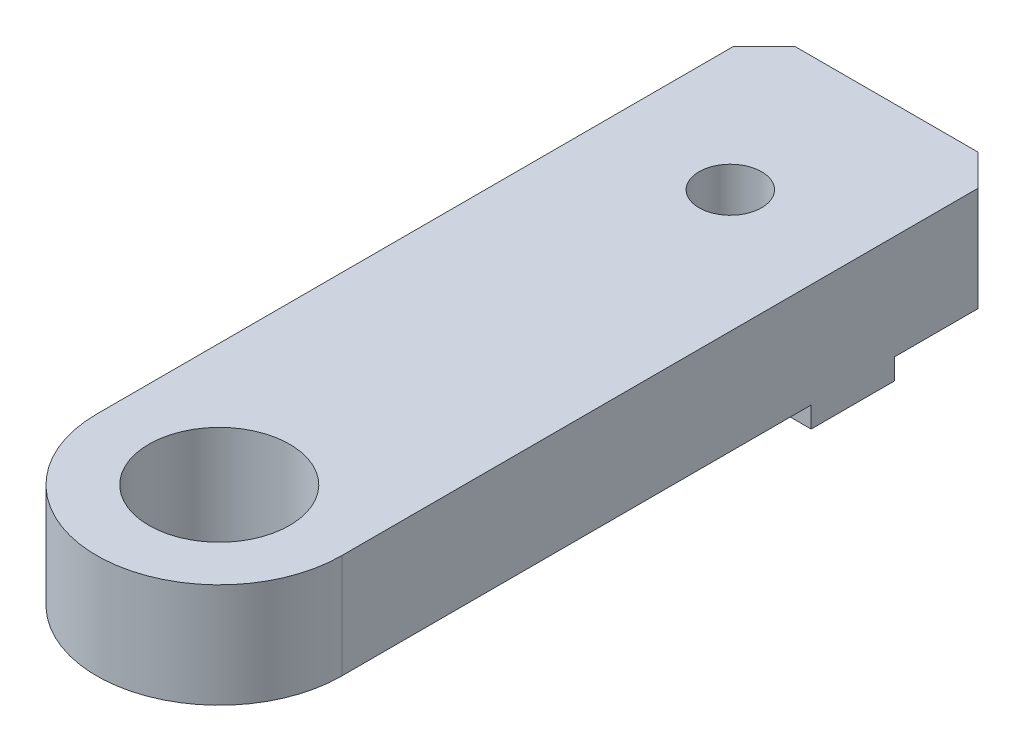
ISO-10303-21;
HEADER;
FILE_DESCRIPTION(('STEP AP214'),'2;1');
FILE_NAME('part.step','',(''),(''),'','','');
FILE_SCHEMA(('AUTOMOTIVE_DESIGN { 1 0 10303 214 1 1 1 1 }'));
ENDSEC;
DATA;
#1=APPLICATION_CONTEXT('core data for automotive mechanical design processes');
#2=APPLICATION_PROTOCOL_DEFINITION('international standard','automotive_design',2000,#1);
#3=PRODUCT_CONTEXT('',#1,'mechanical');
#4=PRODUCT('Part','Part','',(#3));
#5=PRODUCT_RELATED_PRODUCT_CATEGORY('part','',(#4));
#6=PRODUCT_DEFINITION_FORMATION('','',#4);
#7=PRODUCT_DEFINITION_CONTEXT('part definition',#1,'design');
#8=PRODUCT_DEFINITION('design','',#6,#7);
#9=PRODUCT_DEFINITION_SHAPE('','',#8);
#10=(LENGTH_UNIT() NAMED_UNIT(*) SI_UNIT(.MILLI.,.METRE.));
#11=(NAMED_UNIT(*) PLANE_ANGLE_UNIT() SI_UNIT($,.RADIAN.));
#12=(NAMED_UNIT(*) SI_UNIT($,.STERADIAN.) SOLID_ANGLE_UNIT());
#13=UNCERTAINTY_MEASURE_WITH_UNIT(LENGTH_MEASURE(1.E-05),#10,'distance_accuracy_value','');
#14=(GEOMETRIC_REPRESENTATION_CONTEXT(3) GLOBAL_UNCERTAINTY_ASSIGNED_CONTEXT((#13)) GLOBAL_UNIT_ASSIGNED_CONTEXT((#10,
#11,#12)) REPRESENTATION_CONTEXT('',''));
#15=CARTESIAN_POINT('',(0.,0.,0.));
#16=DIRECTION('',(0.,0.,1.));
#17=DIRECTION('',(1.,0.,0.));
#18=AXIS2_PLACEMENT_3D('',#15,#16,#17);
#19=CARTESIAN_POINT('',(0.,-2.,0.));
#20=DIRECTION('',(0.,1.,0.));
#21=DIRECTION('',(0.,0.,1.));
#22=AXIS2_PLACEMENT_3D('',#19,#20,#21);
#23=PLANE('',#22);
#24=CARTESIAN_POINT('',(0.,-2.,-49.));
#25=DIRECTION('',(0.,-1.,0.));
#26=DIRECTION('',(0.,0.,-1.));
#27=AXIS2_PLACEMENT_3D('',#24,#25,#26);
#28=CIRCLE('',#27,6.);
#29=CARTESIAN_POINT('',(5.42104741743151,-2.,-51.5714285714286));
#30=VERTEX_POINT('',#29);
#31=CARTESIAN_POINT('',(5.42104741743151,-2.,-46.4285714285714));
#32=VERTEX_POINT('',#31);
#33=EDGE_CURVE('E330',#30,#32,#28,.T.);
#34=ORIENTED_EDGE('',*,*,#33,.F.);
#35=CARTESIAN_POINT('',(6.32455532033676,-2.,-52.));
#36=DIRECTION('',(0.,1.,0.));
#37=DIRECTION('',(0.,0.,1.));
#38=AXIS2_PLACEMENT_3D('',#35,#36,#37);
#39=CIRCLE('',#38,1.);
#40=CARTESIAN_POINT('',(6.32455532033676,-2.,-53.));
#41=VERTEX_POINT('',#40);
#42=EDGE_CURVE('E259',#30,#41,#39,.F.);
#43=ORIENTED_EDGE('',*,*,#42,.T.);
#44=DIRECTION('',(1.,0.,0.));
#45=VECTOR('',#44,1.);
#46=CARTESIAN_POINT('',(-11.75,-2.,-53.));
#47=LINE('',#46,#45);
#48=CARTESIAN_POINT('',(11.75,-2.,-53.));
#49=VERTEX_POINT('',#48);
#50=EDGE_CURVE('E177',#41,#49,#47,.T.);
#51=ORIENTED_EDGE('',*,*,#50,.T.);
#52=DIRECTION('',(0.,0.,1.));
#53=VECTOR('',#52,1.);
#54=CARTESIAN_POINT('',(11.75,-2.,-53.));
#55=LINE('',#54,#53);
#56=CARTESIAN_POINT('',(11.75,-2.,-45.));
#57=VERTEX_POINT('',#56);
#58=EDGE_CURVE('E174',#49,#57,#55,.T.);
#59=ORIENTED_EDGE('',*,*,#58,.T.);
#60=DIRECTION('',(-1.,0.,0.));
#61=VECTOR('',#60,1.);
#62=CARTESIAN_POINT('',(-11.75,-2.,-45.));
#63=LINE('',#62,#61);
#64=CARTESIAN_POINT('',(6.32455532033676,-2.,-45.));
#65=VERTEX_POINT('',#64);
#66=EDGE_CURVE('E162',#57,#65,#63,.T.);
#67=ORIENTED_EDGE('',*,*,#66,.T.);
#68=CARTESIAN_POINT('',(6.32455532033676,-2.,-46.));
#69=DIRECTION('',(0.,1.,0.));
#70=DIRECTION('',(0.,0.,1.));
#71=AXIS2_PLACEMENT_3D('',#68,#69,#70);
#72=CIRCLE('',#71,1.);
#73=EDGE_CURVE('E257',#65,#32,#72,.F.);
#74=ORIENTED_EDGE('',*,*,#73,.T.);
#75=EDGE_LOOP('',(#34,#43,#51,#59,#67,#74));
#76=FACE_BOUND('',#75,.T.);
#77=ADVANCED_FACE('F37',(#76),#23,.F.);
#78=CARTESIAN_POINT('',(-11.75,-2.,-45.));
#79=DIRECTION('',(0.,0.,-1.));
#80=DIRECTION('',(-1.,0.,0.));
#81=AXIS2_PLACEMENT_3D('',#78,#79,#80);
#82=PLANE('',#81);
#83=DIRECTION('',(-1.,0.,0.));
#84=VECTOR('',#83,1.);
#85=CARTESIAN_POINT('',(-11.75,0.,-45.));
#86=LINE('',#85,#84);
#87=CARTESIAN_POINT('',(11.75,0.,-45.));
#88=VERTEX_POINT('',#87);
#89=CARTESIAN_POINT('',(6.32455532033676,0.,-45.));
#90=VERTEX_POINT('',#89);
#91=EDGE_CURVE('E311',#88,#90,#86,.T.);
#92=ORIENTED_EDGE('',*,*,#91,.T.);
#93=DIRECTION('',(0.,-1.,0.));
#94=VECTOR('',#93,1.);
#95=CARTESIAN_POINT('',(6.32455532033676,-2.,-45.));
#96=LINE('',#95,#94);
#97=EDGE_CURVE('E168',#90,#65,#96,.T.);
#98=ORIENTED_EDGE('',*,*,#97,.T.);
#99=ORIENTED_EDGE('',*,*,#66,.F.);
#100=DIRECTION('',(0.,1.,0.));
#101=VECTOR('',#100,1.);
#102=CARTESIAN_POINT('',(11.75,-2.,-45.));
#103=LINE('',#102,#101);
#104=EDGE_CURVE('E166',#57,#88,#103,.T.);
#105=ORIENTED_EDGE('',*,*,#104,.T.);
#106=EDGE_LOOP('',(#92,#98,#99,#105));
#107=FACE_BOUND('',#106,.T.);
#108=ADVANCED_FACE('F164',(#107),#82,.F.);
#109=CARTESIAN_POINT('',(-11.75,-2.,-53.));
#110=DIRECTION('',(0.,0.,1.));
#111=DIRECTION('',(1.,0.,0.));
#112=AXIS2_PLACEMENT_3D('',#109,#110,#111);
#113=PLANE('',#112);
#114=DIRECTION('',(1.,0.,0.));
#115=VECTOR('',#114,1.);
#116=CARTESIAN_POINT('',(-11.75,0.,-53.));
#117=LINE('',#116,#115);
#118=CARTESIAN_POINT('',(-11.75,0.,-53.));
#119=VERTEX_POINT('',#118);
#120=CARTESIAN_POINT('',(-6.32455532033676,0.,-53.));
#121=VERTEX_POINT('',#120);
#122=EDGE_CURVE('E181',#119,#121,#117,.T.);
#123=ORIENTED_EDGE('',*,*,#122,.T.);
#124=DIRECTION('',(0.,-1.,0.));
#125=VECTOR('',#124,1.);
#126=CARTESIAN_POINT('',(-6.32455532033676,-2.,-53.));
#127=LINE('',#126,#125);
#128=CARTESIAN_POINT('',(-6.32455532033676,-2.,-53.));
#129=VERTEX_POINT('',#128);
#130=EDGE_CURVE('E261',#121,#129,#127,.T.);
#131=ORIENTED_EDGE('',*,*,#130,.T.);
#132=CARTESIAN_POINT('',(-11.75,-2.,-53.));
#133=VERTEX_POINT('',#132);
#134=EDGE_CURVE('E308',#133,#129,#47,.T.);
#135=ORIENTED_EDGE('',*,*,#134,.F.);
#136=DIRECTION('',(0.,1.,0.));
#137=VECTOR('',#136,1.);
#138=CARTESIAN_POINT('',(-11.75,-2.,-53.));
#139=LINE('',#138,#137);
#140=EDGE_CURVE('E195',#133,#119,#139,.T.);
#141=ORIENTED_EDGE('',*,*,#140,.T.);
#142=EDGE_LOOP('',(#123,#131,#135,#141));
#143=FACE_BOUND('',#142,.T.);
#144=ADVANCED_FACE('F320',(#143),#113,.F.);
#145=CARTESIAN_POINT('',(0.,0.,0.));
#146=DIRECTION('',(0.,1.,0.));
#147=DIRECTION('',(0.,0.,1.));
#148=AXIS2_PLACEMENT_3D('',#145,#146,#147);
#149=PLANE('',#148);
#150=CARTESIAN_POINT('',(0.,0.,0.));
#151=DIRECTION('',(0.,1.,0.));
#152=DIRECTION('',(0.,0.,1.));
#153=AXIS2_PLACEMENT_3D('',#150,#151,#152);
#154=CIRCLE('',#153,6.75);
#155=CARTESIAN_POINT('',(0.,0.,6.75));
#156=VERTEX_POINT('',#155);
#157=EDGE_CURVE('E188',#156,#156,#154,.T.);
#158=ORIENTED_EDGE('',*,*,#157,.T.);
#159=EDGE_LOOP('',(#158));
#160=FACE_BOUND('',#159,.T.);
#161=CARTESIAN_POINT('',(-6.32455532033676,0.,-45.));
#162=VERTEX_POINT('',#161);
#163=CARTESIAN_POINT('',(-11.75,0.,-45.));
#164=VERTEX_POINT('',#163);
#165=EDGE_CURVE('E285',#162,#164,#86,.T.);
#166=ORIENTED_EDGE('',*,*,#165,.F.);
#167=CARTESIAN_POINT('',(-6.32455532033676,0.,-46.));
#168=DIRECTION('',(0.,1.,0.));
#169=DIRECTION('',(0.,0.,1.));
#170=AXIS2_PLACEMENT_3D('',#167,#168,#169);
#171=CIRCLE('',#170,1.);
#172=CARTESIAN_POINT('',(-5.42104741743151,0.,-46.4285714285714));
#173=VERTEX_POINT('',#172);
#174=EDGE_CURVE('E45',#162,#173,#171,.T.);
#175=ORIENTED_EDGE('',*,*,#174,.T.);
#176=CARTESIAN_POINT('',(0.,0.,-49.));
#177=DIRECTION('',(0.,1.,0.));
#178=DIRECTION('',(0.,0.,1.));
#179=AXIS2_PLACEMENT_3D('',#176,#177,#178);
#180=CIRCLE('',#179,6.);
#181=CARTESIAN_POINT('',(-5.42104741743151,0.,-51.5714285714286));
#182=VERTEX_POINT('',#181);
#183=EDGE_CURVE('E283',#173,#182,#180,.F.);
#184=ORIENTED_EDGE('',*,*,#183,.T.);
#185=CARTESIAN_POINT('',(-6.32455532033676,0.,-52.));
#186=DIRECTION('',(0.,1.,0.));
#187=DIRECTION('',(0.,0.,1.));
#188=AXIS2_PLACEMENT_3D('',#185,#186,#187);
#189=CIRCLE('',#188,1.);
#190=EDGE_CURVE('E277',#182,#121,#189,.T.);
#191=ORIENTED_EDGE('',*,*,#190,.T.);
#192=ORIENTED_EDGE('',*,*,#122,.F.);
#193=DIRECTION('',(0.,0.,-1.));
#194=VECTOR('',#193,1.);
#195=CARTESIAN_POINT('',(-11.75,0.,0.));
#196=LINE('',#195,#194);
#197=CARTESIAN_POINT('',(-11.75,0.,-61.));
#198=VERTEX_POINT('',#197);
#199=EDGE_CURVE('E226',#119,#198,#196,.T.);
#200=ORIENTED_EDGE('',*,*,#199,.T.);
#201=DIRECTION('',(-0.70710678118655,0.,0.707106781186545));
#202=VECTOR('',#201,1.);
#203=CARTESIAN_POINT('',(-11.75,0.,-61.));
#204=LINE('',#203,#202);
#205=CARTESIAN_POINT('',(-8.74999999999998,0.,-64.));
#206=VERTEX_POINT('',#205);
#207=EDGE_CURVE('E237',#198,#206,#204,.F.);
#208=ORIENTED_EDGE('',*,*,#207,.T.);
#209=DIRECTION('',(1.,0.,0.));
#210=VECTOR('',#209,1.);
#211=CARTESIAN_POINT('',(0.,0.,-64.));
#212=LINE('',#211,#210);
#213=CARTESIAN_POINT('',(8.75,0.,-64.));
#214=VERTEX_POINT('',#213);
#215=EDGE_CURVE('E223',#206,#214,#212,.T.);
#216=ORIENTED_EDGE('',*,*,#215,.T.);
#217=DIRECTION('',(-0.707106781186546,0.,-0.707106781186549));
#218=VECTOR('',#217,1.);
#219=CARTESIAN_POINT('',(8.75,0.,-64.));
#220=LINE('',#219,#218);
#221=CARTESIAN_POINT('',(11.75,0.,-61.));
#222=VERTEX_POINT('',#221);
#223=EDGE_CURVE('E239',#214,#222,#220,.F.);
#224=ORIENTED_EDGE('',*,*,#223,.T.);
#225=DIRECTION('',(0.,0.,1.));
#226=VECTOR('',#225,1.);
#227=CARTESIAN_POINT('',(11.75,0.,0.));
#228=LINE('',#227,#226);
#229=CARTESIAN_POINT('',(11.75,0.,-53.));
#230=VERTEX_POINT('',#229);
#231=EDGE_CURVE('E220',#222,#230,#228,.T.);
#232=ORIENTED_EDGE('',*,*,#231,.T.);
#233=CARTESIAN_POINT('',(6.32455532033676,0.,-53.));
#234=VERTEX_POINT('',#233);
#235=EDGE_CURVE('E313',#234,#230,#117,.T.);
#236=ORIENTED_EDGE('',*,*,#235,.F.);
#237=CARTESIAN_POINT('',(6.32455532033676,0.,-52.));
#238=DIRECTION('',(0.,1.,0.));
#239=DIRECTION('',(0.,0.,1.));
#240=AXIS2_PLACEMENT_3D('',#237,#238,#239);
#241=CIRCLE('',#240,1.);
#242=CARTESIAN_POINT('',(5.42104741743151,0.,-51.5714285714286));
#243=VERTEX_POINT('',#242);
#244=EDGE_CURVE('E275',#234,#243,#241,.T.);
#245=ORIENTED_EDGE('',*,*,#244,.T.);
#246=CARTESIAN_POINT('',(5.42104741743151,0.,-46.4285714285714));
#247=VERTEX_POINT('',#246);
#248=EDGE_CURVE('E292',#243,#247,#180,.F.);
#249=ORIENTED_EDGE('',*,*,#248,.T.);
#250=CARTESIAN_POINT('',(6.32455532033676,0.,-46.));
#251=DIRECTION('',(0.,1.,0.));
#252=DIRECTION('',(0.,0.,1.));
#253=AXIS2_PLACEMENT_3D('',#250,#251,#252);
#254=CIRCLE('',#253,1.);
#255=EDGE_CURVE('E11',#247,#90,#254,.T.);
#256=ORIENTED_EDGE('',*,*,#255,.T.);
#257=ORIENTED_EDGE('',*,*,#91,.F.);
#258=CARTESIAN_POINT('',(11.75,0.,0.));
#259=VERTEX_POINT('',#258);
#260=EDGE_CURVE('E187',#88,#259,#228,.T.);
#261=ORIENTED_EDGE('',*,*,#260,.T.);
#262=CARTESIAN_POINT('',(0.,0.,0.));
#263=DIRECTION('',(0.,1.,0.));
#264=DIRECTION('',(0.,0.,1.));
#265=AXIS2_PLACEMENT_3D('',#262,#263,#264);
#266=CIRCLE('',#265,11.75);
#267=CARTESIAN_POINT('',(-11.75,0.,0.));
#268=VERTEX_POINT('',#267);
#269=EDGE_CURVE('E192',#268,#259,#266,.T.);
#270=ORIENTED_EDGE('',*,*,#269,.F.);
#271=EDGE_CURVE('E203',#268,#164,#196,.T.);
#272=ORIENTED_EDGE('',*,*,#271,.T.);
#273=EDGE_LOOP('',(#166,#175,#184,#191,#192,#200,#208,#216,#224,#232,#236,#245,#249,#256,#257,
#261,#270,#272));
#274=FACE_BOUND('',#273,.T.);
#275=CARTESIAN_POINT('',(0.,0.,-49.));
#276=DIRECTION('',(0.,1.,0.));
#277=DIRECTION('',(0.,0.,1.));
#278=AXIS2_PLACEMENT_3D('',#275,#276,#277);
#279=CIRCLE('',#278,3.);
#280=CARTESIAN_POINT('',(0.,0.,-46.));
#281=VERTEX_POINT('',#280);
#282=EDGE_CURVE('E291',#281,#281,#279,.T.);
#283=ORIENTED_EDGE('',*,*,#282,.T.);
#284=EDGE_LOOP('',(#283));
#285=FACE_BOUND('',#284,.T.);
#286=ADVANCED_FACE('F281',(#160,#274,#285),#149,.F.);
#287=CARTESIAN_POINT('',(0.,10.,0.));
#288=DIRECTION('',(0.,-1.,0.));
#289=DIRECTION('',(0.,0.,-1.));
#290=AXIS2_PLACEMENT_3D('',#287,#288,#289);
#291=CYLINDRICAL_SURFACE('',#290,11.75);
#292=ORIENTED_EDGE('',*,*,#269,.T.);
#293=DIRECTION('',(0.,-1.,0.));
#294=VECTOR('',#293,1.);
#295=CARTESIAN_POINT('',(11.75,10.,0.));
#296=LINE('',#295,#294);
#297=CARTESIAN_POINT('',(11.75,10.,0.));
#298=VERTEX_POINT('',#297);
#299=EDGE_CURVE('E230',#298,#259,#296,.T.);
#300=ORIENTED_EDGE('',*,*,#299,.F.);
#301=CARTESIAN_POINT('',(0.,10.,0.));
#302=DIRECTION('',(0.,1.,0.));
#303=DIRECTION('',(0.,0.,1.));
#304=AXIS2_PLACEMENT_3D('',#301,#302,#303);
#305=CIRCLE('',#304,11.75);
#306=CARTESIAN_POINT('',(-11.75,10.,0.));
#307=VERTEX_POINT('',#306);
#308=EDGE_CURVE('E202',#307,#298,#305,.T.);
#309=ORIENTED_EDGE('',*,*,#308,.F.);
#310=DIRECTION('',(0.,-1.,0.));
#311=VECTOR('',#310,1.);
#312=CARTESIAN_POINT('',(-11.75,10.,0.));
#313=LINE('',#312,#311);
#314=EDGE_CURVE('E216',#307,#268,#313,.T.);
#315=ORIENTED_EDGE('',*,*,#314,.T.);
#316=EDGE_LOOP('',(#292,#300,#309,#315));
#317=FACE_BOUND('',#316,.T.);
#318=ADVANCED_FACE('F341',(#317),#291,.T.);
#319=CARTESIAN_POINT('',(11.75,10.,0.));
#320=DIRECTION('',(1.,0.,0.));
#321=DIRECTION('',(0.,0.,-1.));
#322=AXIS2_PLACEMENT_3D('',#319,#320,#321);
#323=PLANE('',#322);
#324=ORIENTED_EDGE('',*,*,#231,.F.);
#325=DIRECTION('',(0.,1.,0.));
#326=VECTOR('',#325,1.);
#327=CARTESIAN_POINT('',(11.75,10.,-61.));
#328=LINE('',#327,#326);
#329=CARTESIAN_POINT('',(11.75,10.,-61.));
#330=VERTEX_POINT('',#329);
#331=EDGE_CURVE('E241',#222,#330,#328,.T.);
#332=ORIENTED_EDGE('',*,*,#331,.T.);
#333=DIRECTION('',(0.,0.,1.));
#334=VECTOR('',#333,1.);
#335=CARTESIAN_POINT('',(11.75,10.,0.));
#336=LINE('',#335,#334);
#337=EDGE_CURVE('E206',#330,#298,#336,.T.);
#338=ORIENTED_EDGE('',*,*,#337,.T.);
#339=ORIENTED_EDGE('',*,*,#299,.T.);
#340=ORIENTED_EDGE('',*,*,#260,.F.);
#341=ORIENTED_EDGE('',*,*,#104,.F.);
#342=ORIENTED_EDGE('',*,*,#58,.F.);
#343=DIRECTION('',(0.,1.,0.));
#344=VECTOR('',#343,1.);
#345=CARTESIAN_POINT('',(11.75,-2.,-53.));
#346=LINE('',#345,#344);
#347=EDGE_CURVE('E310',#49,#230,#346,.T.);
#348=ORIENTED_EDGE('',*,*,#347,.T.);
#349=EDGE_LOOP('',(#324,#332,#338,#339,#340,#341,#342,#348));
#350=FACE_BOUND('',#349,.T.);
#351=ADVANCED_FACE('F185',(#350),#323,.T.);
#352=CARTESIAN_POINT('',(0.,10.,-64.));
#353=DIRECTION('',(0.,0.,-1.));
#354=DIRECTION('',(-1.,0.,0.));
#355=AXIS2_PLACEMENT_3D('',#352,#353,#354);
#356=PLANE('',#355);
#357=DIRECTION('',(1.,0.,0.));
#358=VECTOR('',#357,1.);
#359=CARTESIAN_POINT('',(0.,10.,-64.));
#360=LINE('',#359,#358);
#361=CARTESIAN_POINT('',(-8.74999999999998,10.,-64.));
#362=VERTEX_POINT('',#361);
#363=CARTESIAN_POINT('',(8.75,10.,-64.));
#364=VERTEX_POINT('',#363);
#365=EDGE_CURVE('E208',#362,#364,#360,.T.);
#366=ORIENTED_EDGE('',*,*,#365,.T.);
#367=DIRECTION('',(0.,-1.,0.));
#368=VECTOR('',#367,1.);
#369=CARTESIAN_POINT('',(8.75,10.,-64.));
#370=LINE('',#369,#368);
#371=EDGE_CURVE('E234',#364,#214,#370,.T.);
#372=ORIENTED_EDGE('',*,*,#371,.T.);
#373=ORIENTED_EDGE('',*,*,#215,.F.);
#374=DIRECTION('',(0.,1.,0.));
#375=VECTOR('',#374,1.);
#376=CARTESIAN_POINT('',(-8.74999999999998,10.,-64.));
#377=LINE('',#376,#375);
#378=EDGE_CURVE('E232',#206,#362,#377,.T.);
#379=ORIENTED_EDGE('',*,*,#378,.T.);
#380=EDGE_LOOP('',(#366,#372,#373,#379));
#381=FACE_BOUND('',#380,.T.);
#382=ADVANCED_FACE('F352',(#381),#356,.T.);
#383=CARTESIAN_POINT('',(-11.75,10.,0.));
#384=DIRECTION('',(-1.,0.,0.));
#385=DIRECTION('',(0.,0.,1.));
#386=AXIS2_PLACEMENT_3D('',#383,#384,#385);
#387=PLANE('',#386);
#388=DIRECTION('',(0.,0.,-1.));
#389=VECTOR('',#388,1.);
#390=CARTESIAN_POINT('',(-11.75,10.,0.));
#391=LINE('',#390,#389);
#392=CARTESIAN_POINT('',(-11.75,10.,-61.));
#393=VERTEX_POINT('',#392);
#394=EDGE_CURVE('E211',#307,#393,#391,.T.);
#395=ORIENTED_EDGE('',*,*,#394,.T.);
#396=DIRECTION('',(0.,-1.,0.));
#397=VECTOR('',#396,1.);
#398=CARTESIAN_POINT('',(-11.75,10.,-61.));
#399=LINE('',#398,#397);
#400=EDGE_CURVE('E247',#393,#198,#399,.T.);
#401=ORIENTED_EDGE('',*,*,#400,.T.);
#402=ORIENTED_EDGE('',*,*,#199,.F.);
#403=ORIENTED_EDGE('',*,*,#140,.F.);
#404=DIRECTION('',(0.,0.,-1.));
#405=VECTOR('',#404,1.);
#406=CARTESIAN_POINT('',(-11.75,-2.,-53.));
#407=LINE('',#406,#405);
#408=CARTESIAN_POINT('',(-11.75,-2.,-45.));
#409=VERTEX_POINT('',#408);
#410=EDGE_CURVE('E170',#409,#133,#407,.T.);
#411=ORIENTED_EDGE('',*,*,#410,.F.);
#412=DIRECTION('',(0.,1.,0.));
#413=VECTOR('',#412,1.);
#414=CARTESIAN_POINT('',(-11.75,-2.,-45.));
#415=LINE('',#414,#413);
#416=EDGE_CURVE('E189',#409,#164,#415,.T.);
#417=ORIENTED_EDGE('',*,*,#416,.T.);
#418=ORIENTED_EDGE('',*,*,#271,.F.);
#419=ORIENTED_EDGE('',*,*,#314,.F.);
#420=EDGE_LOOP('',(#395,#401,#402,#403,#411,#417,#418,#419));
#421=FACE_BOUND('',#420,.T.);
#422=ADVANCED_FACE('F324',(#421),#387,.T.);
#423=CARTESIAN_POINT('',(0.,10.,0.));
#424=DIRECTION('',(0.,-1.,0.));
#425=DIRECTION('',(0.,0.,-1.));
#426=AXIS2_PLACEMENT_3D('',#423,#424,#425);
#427=CYLINDRICAL_SURFACE('',#426,6.75);
#428=CARTESIAN_POINT('',(0.,10.,0.));
#429=DIRECTION('',(0.,1.,0.));
#430=DIRECTION('',(0.,0.,1.));
#431=AXIS2_PLACEMENT_3D('',#428,#429,#430);
#432=CIRCLE('',#431,6.75);
#433=CARTESIAN_POINT('',(0.,10.,6.75));
#434=VERTEX_POINT('',#433);
#435=EDGE_CURVE('E199',#434,#434,#432,.T.);
#436=ORIENTED_EDGE('',*,*,#435,.T.);
#437=EDGE_LOOP('',(#436));
#438=FACE_BOUND('',#437,.T.);
#439=ORIENTED_EDGE('',*,*,#157,.F.);
#440=EDGE_LOOP('',(#439));
#441=FACE_BOUND('',#440,.T.);
#442=ADVANCED_FACE('F390',(#438,#441),#427,.F.);
#443=CARTESIAN_POINT('',(0.,10.,-49.));
#444=DIRECTION('',(0.,-1.,0.));
#445=DIRECTION('',(0.,0.,-1.));
#446=AXIS2_PLACEMENT_3D('',#443,#444,#445);
#447=CYLINDRICAL_SURFACE('',#446,3.);
#448=ORIENTED_EDGE('',*,*,#282,.F.);
#449=EDGE_LOOP('',(#448));
#450=FACE_BOUND('',#449,.T.);
#451=CARTESIAN_POINT('',(0.,10.,-49.));
#452=DIRECTION('',(0.,1.,0.));
#453=DIRECTION('',(0.,0.,1.));
#454=AXIS2_PLACEMENT_3D('',#451,#452,#453);
#455=CIRCLE('',#454,3.);
#456=CARTESIAN_POINT('',(0.,10.,-46.));
#457=VERTEX_POINT('',#456);
#458=EDGE_CURVE('E214',#457,#457,#455,.T.);
#459=ORIENTED_EDGE('',*,*,#458,.T.);
#460=EDGE_LOOP('',(#459));
#461=FACE_BOUND('',#460,.T.);
#462=ADVANCED_FACE('F384',(#450,#461),#447,.F.);
#463=CARTESIAN_POINT('',(0.,10.,0.));
#464=DIRECTION('',(0.,1.,0.));
#465=DIRECTION('',(0.,0.,1.));
#466=AXIS2_PLACEMENT_3D('',#463,#464,#465);
#467=PLANE('',#466);
#468=ORIENTED_EDGE('',*,*,#435,.F.);
#469=EDGE_LOOP('',(#468));
#470=FACE_BOUND('',#469,.T.);
#471=ORIENTED_EDGE('',*,*,#337,.F.);
#472=DIRECTION('',(0.707106781186546,0.,0.707106781186549));
#473=VECTOR('',#472,1.);
#474=CARTESIAN_POINT('',(36.375,10.,-36.3749999999999));
#475=LINE('',#474,#473);
#476=EDGE_CURVE('E245',#330,#364,#475,.F.);
#477=ORIENTED_EDGE('',*,*,#476,.T.);
#478=ORIENTED_EDGE('',*,*,#365,.F.);
#479=DIRECTION('',(0.70710678118655,0.,-0.707106781186545));
#480=VECTOR('',#479,1.);
#481=CARTESIAN_POINT('',(-36.375,10.,-36.3750000000002));
#482=LINE('',#481,#480);
#483=EDGE_CURVE('E243',#362,#393,#482,.F.);
#484=ORIENTED_EDGE('',*,*,#483,.T.);
#485=ORIENTED_EDGE('',*,*,#394,.F.);
#486=ORIENTED_EDGE('',*,*,#308,.T.);
#487=EDGE_LOOP('',(#471,#477,#478,#484,#485,#486));
#488=FACE_BOUND('',#487,.T.);
#489=ORIENTED_EDGE('',*,*,#458,.F.);
#490=EDGE_LOOP('',(#489));
#491=FACE_BOUND('',#490,.T.);
#492=ADVANCED_FACE('F344',(#470,#488,#491),#467,.T.);
#493=ORIENTED_EDGE('',*,*,#134,.T.);
#494=CARTESIAN_POINT('',(-6.32455532033676,-2.,-52.));
#495=DIRECTION('',(0.,1.,0.));
#496=DIRECTION('',(0.,0.,1.));
#497=AXIS2_PLACEMENT_3D('',#494,#495,#496);
#498=CIRCLE('',#497,1.);
#499=CARTESIAN_POINT('',(-5.42104741743151,-2.,-51.5714285714286));
#500=VERTEX_POINT('',#499);
#501=EDGE_CURVE('E266',#129,#500,#498,.F.);
#502=ORIENTED_EDGE('',*,*,#501,.T.);
#503=CARTESIAN_POINT('',(-5.42104741743151,-2.,-46.4285714285714));
#504=VERTEX_POINT('',#503);
#505=EDGE_CURVE('E301',#504,#500,#28,.T.);
#506=ORIENTED_EDGE('',*,*,#505,.F.);
#507=CARTESIAN_POINT('',(-6.32455532033676,-2.,-46.));
#508=DIRECTION('',(0.,1.,0.));
#509=DIRECTION('',(0.,0.,1.));
#510=AXIS2_PLACEMENT_3D('',#507,#508,#509);
#511=CIRCLE('',#510,1.);
#512=CARTESIAN_POINT('',(-6.32455532033676,-2.,-45.));
#513=VERTEX_POINT('',#512);
#514=EDGE_CURVE('E264',#504,#513,#511,.F.);
#515=ORIENTED_EDGE('',*,*,#514,.T.);
#516=EDGE_CURVE('E171',#513,#409,#63,.T.);
#517=ORIENTED_EDGE('',*,*,#516,.T.);
#518=ORIENTED_EDGE('',*,*,#410,.T.);
#519=EDGE_LOOP('',(#493,#502,#506,#515,#517,#518));
#520=FACE_BOUND('',#519,.T.);
#521=ADVANCED_FACE('F299',(#520),#23,.F.);
#522=ORIENTED_EDGE('',*,*,#516,.F.);
#523=DIRECTION('',(0.,-1.,0.));
#524=VECTOR('',#523,1.);
#525=CARTESIAN_POINT('',(-6.32455532033676,-2.,-45.));
#526=LINE('',#525,#524);
#527=EDGE_CURVE('E272',#513,#162,#526,.F.);
#528=ORIENTED_EDGE('',*,*,#527,.T.);
#529=ORIENTED_EDGE('',*,*,#165,.T.);
#530=ORIENTED_EDGE('',*,*,#416,.F.);
#531=EDGE_LOOP('',(#522,#528,#529,#530));
#532=FACE_BOUND('',#531,.T.);
#533=ADVANCED_FACE('F303',(#532),#82,.F.);
#534=ORIENTED_EDGE('',*,*,#50,.F.);
#535=DIRECTION('',(0.,-1.,0.));
#536=VECTOR('',#535,1.);
#537=CARTESIAN_POINT('',(6.32455532033676,-2.,-53.));
#538=LINE('',#537,#536);
#539=EDGE_CURVE('E250',#41,#234,#538,.F.);
#540=ORIENTED_EDGE('',*,*,#539,.T.);
#541=ORIENTED_EDGE('',*,*,#235,.T.);
#542=ORIENTED_EDGE('',*,*,#347,.F.);
#543=EDGE_LOOP('',(#534,#540,#541,#542));
#544=FACE_BOUND('',#543,.T.);
#545=ADVANCED_FACE('F360',(#544),#113,.F.);
#546=CARTESIAN_POINT('',(8.75,10.,-64.));
#547=DIRECTION('',(-0.707106781186549,0.,0.707106781186546));
#548=DIRECTION('',(0.,-1.,0.));
#549=AXIS2_PLACEMENT_3D('',#546,#547,#548);
#550=PLANE('',#549);
#551=ORIENTED_EDGE('',*,*,#476,.F.);
#552=ORIENTED_EDGE('',*,*,#331,.F.);
#553=ORIENTED_EDGE('',*,*,#223,.F.);
#554=ORIENTED_EDGE('',*,*,#371,.F.);
#555=EDGE_LOOP('',(#551,#552,#553,#554));
#556=FACE_BOUND('',#555,.T.);
#557=ADVANCED_FACE('F358',(#556),#550,.F.);
#558=CARTESIAN_POINT('',(-11.75,10.,-61.));
#559=DIRECTION('',(0.707106781186545,0.,0.70710678118655));
#560=DIRECTION('',(0.,-1.,0.));
#561=AXIS2_PLACEMENT_3D('',#558,#559,#560);
#562=PLANE('',#561);
#563=ORIENTED_EDGE('',*,*,#483,.F.);
#564=ORIENTED_EDGE('',*,*,#378,.F.);
#565=ORIENTED_EDGE('',*,*,#207,.F.);
#566=ORIENTED_EDGE('',*,*,#400,.F.);
#567=EDGE_LOOP('',(#563,#564,#565,#566));
#568=FACE_BOUND('',#567,.T.);
#569=ADVANCED_FACE('F350',(#568),#562,.F.);
#570=CARTESIAN_POINT('',(0.,16.9705627484771,-49.));
#571=DIRECTION('',(0.,-1.,0.));
#572=DIRECTION('',(0.,0.,-1.));
#573=AXIS2_PLACEMENT_3D('',#570,#571,#572);
#574=CYLINDRICAL_SURFACE('',#573,6.);
#575=ORIENTED_EDGE('',*,*,#248,.F.);
#576=DIRECTION('',(0.,-1.,0.));
#577=VECTOR('',#576,1.);
#578=CARTESIAN_POINT('',(5.42104741743151,16.9705627484771,-51.5714285714286));
#579=LINE('',#578,#577);
#580=EDGE_CURVE('E255',#243,#30,#579,.T.);
#581=ORIENTED_EDGE('',*,*,#580,.T.);
#582=ORIENTED_EDGE('',*,*,#33,.T.);
#583=DIRECTION('',(0.,-1.,0.));
#584=VECTOR('',#583,1.);
#585=CARTESIAN_POINT('',(5.42104741743151,16.9705627484771,-46.4285714285714));
#586=LINE('',#585,#584);
#587=EDGE_CURVE('E253',#32,#247,#586,.F.);
#588=ORIENTED_EDGE('',*,*,#587,.T.);
#589=EDGE_LOOP('',(#575,#581,#582,#588));
#590=FACE_BOUND('',#589,.T.);
#591=ADVANCED_FACE('F366',(#590),#574,.F.);
#592=ORIENTED_EDGE('',*,*,#505,.T.);
#593=DIRECTION('',(0.,-1.,0.));
#594=VECTOR('',#593,1.);
#595=CARTESIAN_POINT('',(-5.42104741743151,16.9705627484771,-51.5714285714286));
#596=LINE('',#595,#594);
#597=EDGE_CURVE('E270',#500,#182,#596,.F.);
#598=ORIENTED_EDGE('',*,*,#597,.T.);
#599=ORIENTED_EDGE('',*,*,#183,.F.);
#600=DIRECTION('',(0.,-1.,0.));
#601=VECTOR('',#600,1.);
#602=CARTESIAN_POINT('',(-5.42104741743151,16.9705627484771,-46.4285714285714));
#603=LINE('',#602,#601);
#604=EDGE_CURVE('E268',#173,#504,#603,.T.);
#605=ORIENTED_EDGE('',*,*,#604,.T.);
#606=EDGE_LOOP('',(#592,#598,#599,#605));
#607=FACE_BOUND('',#606,.T.);
#608=ADVANCED_FACE('F288',(#607),#574,.F.);
#609=CARTESIAN_POINT('',(6.32455532033676,16.9705627484771,-52.));
#610=DIRECTION('',(0.,-1.,0.));
#611=DIRECTION('',(0.,0.,-1.));
#612=AXIS2_PLACEMENT_3D('',#609,#610,#611);
#613=CYLINDRICAL_SURFACE('',#612,1.);
#614=ORIENTED_EDGE('',*,*,#42,.F.);
#615=ORIENTED_EDGE('',*,*,#580,.F.);
#616=ORIENTED_EDGE('',*,*,#244,.F.);
#617=ORIENTED_EDGE('',*,*,#539,.F.);
#618=EDGE_LOOP('',(#614,#615,#616,#617));
#619=FACE_BOUND('',#618,.T.);
#620=ADVANCED_FACE('F482',(#619),#613,.T.);
#621=CARTESIAN_POINT('',(-6.32455532033676,16.9705627484771,-52.));
#622=DIRECTION('',(0.,-1.,0.));
#623=DIRECTION('',(0.,0.,-1.));
#624=AXIS2_PLACEMENT_3D('',#621,#622,#623);
#625=CYLINDRICAL_SURFACE('',#624,1.);
#626=ORIENTED_EDGE('',*,*,#190,.F.);
#627=ORIENTED_EDGE('',*,*,#597,.F.);
#628=ORIENTED_EDGE('',*,*,#501,.F.);
#629=ORIENTED_EDGE('',*,*,#130,.F.);
#630=EDGE_LOOP('',(#626,#627,#628,#629));
#631=FACE_BOUND('',#630,.T.);
#632=ADVANCED_FACE('F329',(#631),#625,.T.);
#633=CARTESIAN_POINT('',(-6.32455532033676,16.9705627484771,-46.));
#634=DIRECTION('',(0.,-1.,0.));
#635=DIRECTION('',(0.,0.,-1.));
#636=AXIS2_PLACEMENT_3D('',#633,#634,#635);
#637=CYLINDRICAL_SURFACE('',#636,1.);
#638=ORIENTED_EDGE('',*,*,#514,.F.);
#639=ORIENTED_EDGE('',*,*,#604,.F.);
#640=ORIENTED_EDGE('',*,*,#174,.F.);
#641=ORIENTED_EDGE('',*,*,#527,.F.);
#642=EDGE_LOOP('',(#638,#639,#640,#641));
#643=FACE_BOUND('',#642,.T.);
#644=ADVANCED_FACE('F295',(#643),#637,.T.);
#645=CARTESIAN_POINT('',(6.32455532033676,16.9705627484771,-46.));
#646=DIRECTION('',(0.,-1.,0.));
#647=DIRECTION('',(0.,0.,-1.));
#648=AXIS2_PLACEMENT_3D('',#645,#646,#647);
#649=CYLINDRICAL_SURFACE('',#648,1.);
#650=ORIENTED_EDGE('',*,*,#255,.F.);
#651=ORIENTED_EDGE('',*,*,#587,.F.);
#652=ORIENTED_EDGE('',*,*,#73,.F.);
#653=ORIENTED_EDGE('',*,*,#97,.F.);
#654=EDGE_LOOP('',(#650,#651,#652,#653));
#655=FACE_BOUND('',#654,.T.);
#656=ADVANCED_FACE('F39',(#655),#649,.T.);
#657=CLOSED_SHELL('',(#77,#108,#144,#286,#318,#351,#382,#422,#442,#462,#492,#521,#533,#545,#557,
#569,#591,#608,#620,#632,#644,#656));
#658=MANIFOLD_SOLID_BREP('B2',#657);
#659=ADVANCED_BREP_SHAPE_REPRESENTATION('',(#18,#658),#14);
#660=SHAPE_DEFINITION_REPRESENTATION(#9,#659);
ENDSEC;
END-ISO-10303-21;
